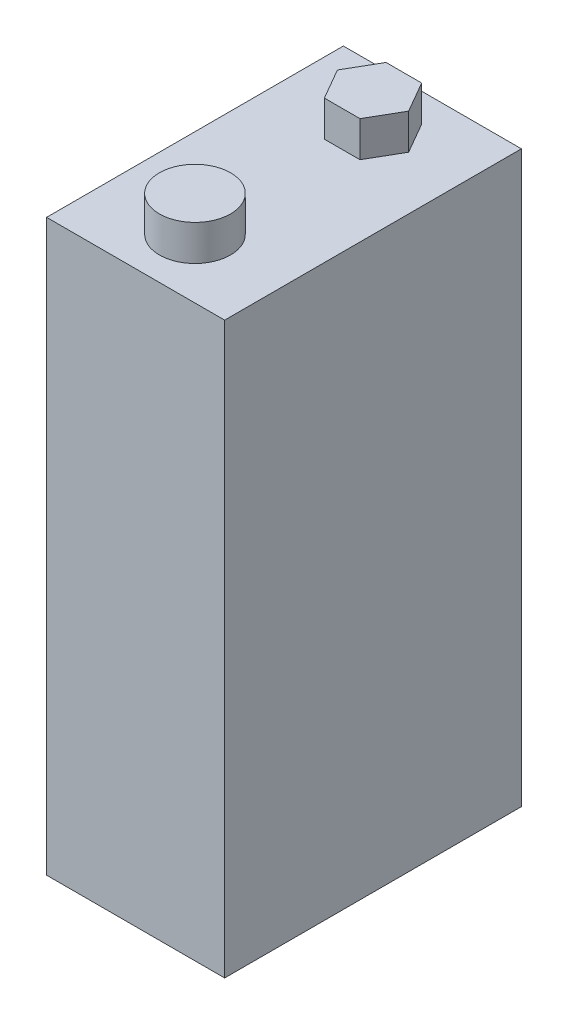
ISO-10303-21;
HEADER;
FILE_DESCRIPTION(('STEP AP214'),'2;1');
FILE_NAME('part.step','',(''),(''),'','','');
FILE_SCHEMA(('AUTOMOTIVE_DESIGN { 1 0 10303 214 1 1 1 1 }'));
ENDSEC;
DATA;
#1=APPLICATION_CONTEXT('core data for automotive mechanical design processes');
#2=APPLICATION_PROTOCOL_DEFINITION('international standard','automotive_design',2000,#1);
#3=PRODUCT_CONTEXT('',#1,'mechanical');
#4=PRODUCT('Part','Part','',(#3));
#5=PRODUCT_RELATED_PRODUCT_CATEGORY('part','',(#4));
#6=PRODUCT_DEFINITION_FORMATION('','',#4);
#7=PRODUCT_DEFINITION_CONTEXT('part definition',#1,'design');
#8=PRODUCT_DEFINITION('design','',#6,#7);
#9=PRODUCT_DEFINITION_SHAPE('','',#8);
#10=(LENGTH_UNIT() NAMED_UNIT(*) SI_UNIT(.MILLI.,.METRE.));
#11=(NAMED_UNIT(*) PLANE_ANGLE_UNIT() SI_UNIT($,.RADIAN.));
#12=(NAMED_UNIT(*) SI_UNIT($,.STERADIAN.) SOLID_ANGLE_UNIT());
#13=UNCERTAINTY_MEASURE_WITH_UNIT(LENGTH_MEASURE(1.E-05),#10,'distance_accuracy_value','');
#14=(GEOMETRIC_REPRESENTATION_CONTEXT(3) GLOBAL_UNCERTAINTY_ASSIGNED_CONTEXT((#13)) GLOBAL_UNIT_ASSIGNED_CONTEXT((#10,
#11,#12)) REPRESENTATION_CONTEXT('',''));
#15=CARTESIAN_POINT('',(0.,0.,0.));
#16=DIRECTION('',(0.,0.,1.));
#17=DIRECTION('',(1.,0.,0.));
#18=AXIS2_PLACEMENT_3D('',#15,#16,#17);
#19=CARTESIAN_POINT('',(15.,0.,0.));
#20=DIRECTION('',(0.,-1.,0.));
#21=DIRECTION('',(0.,0.,-1.));
#22=AXIS2_PLACEMENT_3D('',#19,#20,#21);
#23=PLANE('',#22);
#24=DIRECTION('',(0.,0.,1.));
#25=VECTOR('',#24,1.);
#26=CARTESIAN_POINT('',(0.,0.,0.));
#27=LINE('',#26,#25);
#28=CARTESIAN_POINT('',(0.,0.,-25.));
#29=VERTEX_POINT('',#28);
#30=CARTESIAN_POINT('',(0.,0.,0.));
#31=VERTEX_POINT('',#30);
#32=EDGE_CURVE('E144',#29,#31,#27,.T.);
#33=ORIENTED_EDGE('',*,*,#32,.T.);
#34=DIRECTION('',(-1.,0.,0.));
#35=VECTOR('',#34,1.);
#36=CARTESIAN_POINT('',(15.,0.,0.));
#37=LINE('',#36,#35);
#38=CARTESIAN_POINT('',(15.,0.,0.));
#39=VERTEX_POINT('',#38);
#40=EDGE_CURVE('E150',#39,#31,#37,.T.);
#41=ORIENTED_EDGE('',*,*,#40,.F.);
#42=DIRECTION('',(0.,0.,1.));
#43=VECTOR('',#42,1.);
#44=CARTESIAN_POINT('',(15.,0.,0.));
#45=LINE('',#44,#43);
#46=CARTESIAN_POINT('',(15.,0.,-25.));
#47=VERTEX_POINT('',#46);
#48=EDGE_CURVE('E148',#47,#39,#45,.T.);
#49=ORIENTED_EDGE('',*,*,#48,.F.);
#50=DIRECTION('',(-1.,0.,0.));
#51=VECTOR('',#50,1.);
#52=CARTESIAN_POINT('',(15.,0.,-25.));
#53=LINE('',#52,#51);
#54=EDGE_CURVE('E160',#47,#29,#53,.T.);
#55=ORIENTED_EDGE('',*,*,#54,.T.);
#56=EDGE_LOOP('',(#33,#41,#49,#55));
#57=FACE_BOUND('',#56,.T.);
#58=CARTESIAN_POINT('',(7.5,0.,-5.));
#59=DIRECTION('',(0.,-1.,0.));
#60=DIRECTION('',(0.,0.,-1.));
#61=AXIS2_PLACEMENT_3D('',#58,#59,#60);
#62=CIRCLE('',#61,3.);
#63=CARTESIAN_POINT('',(7.5,0.,-8.));
#64=VERTEX_POINT('',#63);
#65=EDGE_CURVE('E11',#64,#64,#62,.F.);
#66=ORIENTED_EDGE('',*,*,#65,.F.);
#67=EDGE_LOOP('',(#66));
#68=FACE_BOUND('',#67,.T.);
#69=DIRECTION('',(-0.499999999999995,0.,0.866025403784441));
#70=VECTOR('',#69,1.);
#71=CARTESIAN_POINT('',(5.99999999999997,0.,-22.5980762113533));
#72=LINE('',#71,#70);
#73=CARTESIAN_POINT('',(5.99999999999997,0.,-22.5980762113533));
#74=VERTEX_POINT('',#73);
#75=CARTESIAN_POINT('',(4.5,0.,-20.));
#76=VERTEX_POINT('',#75);
#77=EDGE_CURVE('E130',#74,#76,#72,.T.);
#78=ORIENTED_EDGE('',*,*,#77,.F.);
#79=DIRECTION('',(-1.,0.,0.));
#80=VECTOR('',#79,1.);
#81=CARTESIAN_POINT('',(8.99999999999998,0.,-22.5980762113533));
#82=LINE('',#81,#80);
#83=CARTESIAN_POINT('',(8.99999999999998,0.,-22.5980762113533));
#84=VERTEX_POINT('',#83);
#85=EDGE_CURVE('E127',#84,#74,#82,.T.);
#86=ORIENTED_EDGE('',*,*,#85,.F.);
#87=DIRECTION('',(-0.500000000000007,0.,-0.866025403784434));
#88=VECTOR('',#87,1.);
#89=CARTESIAN_POINT('',(10.5,0.,-20.));
#90=LINE('',#89,#88);
#91=CARTESIAN_POINT('',(10.5,0.,-20.));
#92=VERTEX_POINT('',#91);
#93=EDGE_CURVE('E317',#92,#84,#90,.T.);
#94=ORIENTED_EDGE('',*,*,#93,.F.);
#95=DIRECTION('',(0.499999999999995,0.,-0.866025403784442));
#96=VECTOR('',#95,1.);
#97=CARTESIAN_POINT('',(9.00000000000001,0.,-17.4019237886467));
#98=LINE('',#97,#96);
#99=CARTESIAN_POINT('',(9.00000000000001,0.,-17.4019237886467));
#100=VERTEX_POINT('',#99);
#101=EDGE_CURVE('E332',#100,#92,#98,.T.);
#102=ORIENTED_EDGE('',*,*,#101,.F.);
#103=DIRECTION('',(1.,0.,0.));
#104=VECTOR('',#103,1.);
#105=CARTESIAN_POINT('',(6.00000000000001,0.,-17.4019237886467));
#106=LINE('',#105,#104);
#107=CARTESIAN_POINT('',(6.00000000000001,0.,-17.4019237886467));
#108=VERTEX_POINT('',#107);
#109=EDGE_CURVE('E53',#108,#100,#106,.T.);
#110=ORIENTED_EDGE('',*,*,#109,.F.);
#111=DIRECTION('',(0.500000000000001,0.,0.866025403784438));
#112=VECTOR('',#111,1.);
#113=CARTESIAN_POINT('',(4.5,0.,-20.));
#114=LINE('',#113,#112);
#115=EDGE_CURVE('E48',#76,#108,#114,.T.);
#116=ORIENTED_EDGE('',*,*,#115,.F.);
#117=EDGE_LOOP('',(#78,#86,#94,#102,#110,#116));
#118=FACE_BOUND('',#117,.T.);
#119=ADVANCED_FACE('F33',(#57,#68,#118),#23,.F.);
#120=CARTESIAN_POINT('',(15.,0.,0.));
#121=DIRECTION('',(0.,0.,-1.));
#122=DIRECTION('',(0.,1.,0.));
#123=AXIS2_PLACEMENT_3D('',#120,#121,#122);
#124=PLANE('',#123);
#125=DIRECTION('',(0.,-1.,0.));
#126=VECTOR('',#125,1.);
#127=CARTESIAN_POINT('',(0.,0.,0.));
#128=LINE('',#127,#126);
#129=CARTESIAN_POINT('',(0.,-48.,0.));
#130=VERTEX_POINT('',#129);
#131=EDGE_CURVE('E134',#31,#130,#128,.T.);
#132=ORIENTED_EDGE('',*,*,#131,.T.);
#133=DIRECTION('',(-1.,0.,0.));
#134=VECTOR('',#133,1.);
#135=CARTESIAN_POINT('',(15.,-48.,0.));
#136=LINE('',#135,#134);
#137=CARTESIAN_POINT('',(15.,-48.,0.));
#138=VERTEX_POINT('',#137);
#139=EDGE_CURVE('E41',#138,#130,#136,.T.);
#140=ORIENTED_EDGE('',*,*,#139,.F.);
#141=DIRECTION('',(0.,-1.,0.));
#142=VECTOR('',#141,1.);
#143=CARTESIAN_POINT('',(15.,0.,0.));
#144=LINE('',#143,#142);
#145=EDGE_CURVE('E140',#39,#138,#144,.T.);
#146=ORIENTED_EDGE('',*,*,#145,.F.);
#147=ORIENTED_EDGE('',*,*,#40,.T.);
#148=EDGE_LOOP('',(#132,#140,#146,#147));
#149=FACE_BOUND('',#148,.T.);
#150=ADVANCED_FACE('F35',(#149),#124,.F.);
#151=CARTESIAN_POINT('',(15.,-48.,0.));
#152=DIRECTION('',(0.,1.,0.));
#153=DIRECTION('',(0.,0.,1.));
#154=AXIS2_PLACEMENT_3D('',#151,#152,#153);
#155=PLANE('',#154);
#156=DIRECTION('',(0.,0.,-1.));
#157=VECTOR('',#156,1.);
#158=CARTESIAN_POINT('',(0.,-48.,0.));
#159=LINE('',#158,#157);
#160=CARTESIAN_POINT('',(0.,-48.,-25.));
#161=VERTEX_POINT('',#160);
#162=EDGE_CURVE('E153',#130,#161,#159,.T.);
#163=ORIENTED_EDGE('',*,*,#162,.T.);
#164=DIRECTION('',(-1.,0.,0.));
#165=VECTOR('',#164,1.);
#166=CARTESIAN_POINT('',(15.,-48.,-25.));
#167=LINE('',#166,#165);
#168=CARTESIAN_POINT('',(15.,-48.,-25.));
#169=VERTEX_POINT('',#168);
#170=EDGE_CURVE('E163',#169,#161,#167,.T.);
#171=ORIENTED_EDGE('',*,*,#170,.F.);
#172=DIRECTION('',(0.,0.,-1.));
#173=VECTOR('',#172,1.);
#174=CARTESIAN_POINT('',(15.,-48.,0.));
#175=LINE('',#174,#173);
#176=EDGE_CURVE('E143',#138,#169,#175,.T.);
#177=ORIENTED_EDGE('',*,*,#176,.F.);
#178=ORIENTED_EDGE('',*,*,#139,.T.);
#179=EDGE_LOOP('',(#163,#171,#177,#178));
#180=FACE_BOUND('',#179,.T.);
#181=ADVANCED_FACE('F168',(#180),#155,.F.);
#182=CARTESIAN_POINT('',(15.,0.,-25.));
#183=DIRECTION('',(0.,0.,1.));
#184=DIRECTION('',(0.,-1.,0.));
#185=AXIS2_PLACEMENT_3D('',#182,#183,#184);
#186=PLANE('',#185);
#187=DIRECTION('',(0.,1.,0.));
#188=VECTOR('',#187,1.);
#189=CARTESIAN_POINT('',(0.,0.,-25.));
#190=LINE('',#189,#188);
#191=EDGE_CURVE('E155',#161,#29,#190,.T.);
#192=ORIENTED_EDGE('',*,*,#191,.T.);
#193=ORIENTED_EDGE('',*,*,#54,.F.);
#194=DIRECTION('',(0.,1.,0.));
#195=VECTOR('',#194,1.);
#196=CARTESIAN_POINT('',(15.,0.,-25.));
#197=LINE('',#196,#195);
#198=EDGE_CURVE('E146',#169,#47,#197,.T.);
#199=ORIENTED_EDGE('',*,*,#198,.F.);
#200=ORIENTED_EDGE('',*,*,#170,.T.);
#201=EDGE_LOOP('',(#192,#193,#199,#200));
#202=FACE_BOUND('',#201,.T.);
#203=ADVANCED_FACE('F180',(#202),#186,.F.);
#204=CARTESIAN_POINT('',(15.,0.,0.));
#205=DIRECTION('',(1.,0.,0.));
#206=DIRECTION('',(0.,0.,-1.));
#207=AXIS2_PLACEMENT_3D('',#204,#205,#206);
#208=PLANE('',#207);
#209=ORIENTED_EDGE('',*,*,#145,.T.);
#210=ORIENTED_EDGE('',*,*,#176,.T.);
#211=ORIENTED_EDGE('',*,*,#198,.T.);
#212=ORIENTED_EDGE('',*,*,#48,.T.);
#213=EDGE_LOOP('',(#209,#210,#211,#212));
#214=FACE_BOUND('',#213,.T.);
#215=ADVANCED_FACE('F186',(#214),#208,.T.);
#216=CARTESIAN_POINT('',(0.,0.,0.));
#217=DIRECTION('',(1.,0.,0.));
#218=DIRECTION('',(0.,0.,-1.));
#219=AXIS2_PLACEMENT_3D('',#216,#217,#218);
#220=PLANE('',#219);
#221=ORIENTED_EDGE('',*,*,#131,.F.);
#222=ORIENTED_EDGE('',*,*,#32,.F.);
#223=ORIENTED_EDGE('',*,*,#191,.F.);
#224=ORIENTED_EDGE('',*,*,#162,.F.);
#225=EDGE_LOOP('',(#221,#222,#223,#224));
#226=FACE_BOUND('',#225,.T.);
#227=ADVANCED_FACE('F176',(#226),#220,.F.);
#228=CARTESIAN_POINT('',(7.5,3.,-5.));
#229=DIRECTION('',(0.,-1.,0.));
#230=DIRECTION('',(0.,0.,-1.));
#231=AXIS2_PLACEMENT_3D('',#228,#229,#230);
#232=CYLINDRICAL_SURFACE('',#231,3.);
#233=CARTESIAN_POINT('',(7.5,3.,-5.));
#234=DIRECTION('',(0.,1.,0.));
#235=DIRECTION('',(0.,0.,1.));
#236=AXIS2_PLACEMENT_3D('',#233,#234,#235);
#237=CIRCLE('',#236,3.);
#238=CARTESIAN_POINT('',(7.5,3.,-2.));
#239=VERTEX_POINT('',#238);
#240=EDGE_CURVE('E131',#239,#239,#237,.T.);
#241=ORIENTED_EDGE('',*,*,#240,.F.);
#242=EDGE_LOOP('',(#241));
#243=FACE_BOUND('',#242,.T.);
#244=ORIENTED_EDGE('',*,*,#65,.T.);
#245=EDGE_LOOP('',(#244));
#246=FACE_BOUND('',#245,.T.);
#247=ADVANCED_FACE('F193',(#243,#246),#232,.T.);
#248=CARTESIAN_POINT('',(7.5,3.,-5.));
#249=DIRECTION('',(0.,1.,0.));
#250=DIRECTION('',(0.,0.,1.));
#251=AXIS2_PLACEMENT_3D('',#248,#249,#250);
#252=PLANE('',#251);
#253=ORIENTED_EDGE('',*,*,#240,.T.);
#254=EDGE_LOOP('',(#253));
#255=FACE_BOUND('',#254,.T.);
#256=ADVANCED_FACE('F234',(#255),#252,.T.);
#257=CARTESIAN_POINT('',(5.99999999999997,3.,-22.5980762113533));
#258=DIRECTION('',(0.866025403784441,0.,0.499999999999995));
#259=DIRECTION('',(0.499999999999995,0.,-0.866025403784442));
#260=AXIS2_PLACEMENT_3D('',#257,#258,#259);
#261=PLANE('',#260);
#262=ORIENTED_EDGE('',*,*,#77,.T.);
#263=DIRECTION('',(0.,-1.,0.));
#264=VECTOR('',#263,1.);
#265=CARTESIAN_POINT('',(4.5,3.,-20.));
#266=LINE('',#265,#264);
#267=CARTESIAN_POINT('',(4.5,3.,-20.));
#268=VERTEX_POINT('',#267);
#269=EDGE_CURVE('E111',#268,#76,#266,.T.);
#270=ORIENTED_EDGE('',*,*,#269,.F.);
#271=DIRECTION('',(-0.499999999999995,0.,0.866025403784441));
#272=VECTOR('',#271,1.);
#273=CARTESIAN_POINT('',(5.99999999999997,3.,-22.5980762113533));
#274=LINE('',#273,#272);
#275=CARTESIAN_POINT('',(5.99999999999997,3.,-22.5980762113533));
#276=VERTEX_POINT('',#275);
#277=EDGE_CURVE('E118',#276,#268,#274,.T.);
#278=ORIENTED_EDGE('',*,*,#277,.F.);
#279=DIRECTION('',(0.,-1.,0.));
#280=VECTOR('',#279,1.);
#281=CARTESIAN_POINT('',(5.99999999999997,3.,-22.5980762113533));
#282=LINE('',#281,#280);
#283=EDGE_CURVE('E313',#276,#74,#282,.T.);
#284=ORIENTED_EDGE('',*,*,#283,.T.);
#285=EDGE_LOOP('',(#262,#270,#278,#284));
#286=FACE_BOUND('',#285,.T.);
#287=ADVANCED_FACE('F129',(#286),#261,.F.);
#288=CARTESIAN_POINT('',(4.5,3.,-20.));
#289=DIRECTION('',(0.866025403784438,0.,-0.500000000000001));
#290=DIRECTION('',(-0.500000000000001,0.,-0.866025403784438));
#291=AXIS2_PLACEMENT_3D('',#288,#289,#290);
#292=PLANE('',#291);
#293=ORIENTED_EDGE('',*,*,#115,.T.);
#294=DIRECTION('',(0.,-1.,0.));
#295=VECTOR('',#294,1.);
#296=CARTESIAN_POINT('',(6.00000000000001,3.,-17.4019237886467));
#297=LINE('',#296,#295);
#298=CARTESIAN_POINT('',(6.00000000000001,3.,-17.4019237886467));
#299=VERTEX_POINT('',#298);
#300=EDGE_CURVE('E114',#299,#108,#297,.T.);
#301=ORIENTED_EDGE('',*,*,#300,.F.);
#302=DIRECTION('',(0.500000000000001,0.,0.866025403784438));
#303=VECTOR('',#302,1.);
#304=CARTESIAN_POINT('',(4.5,3.,-20.));
#305=LINE('',#304,#303);
#306=EDGE_CURVE('E107',#268,#299,#305,.T.);
#307=ORIENTED_EDGE('',*,*,#306,.F.);
#308=ORIENTED_EDGE('',*,*,#269,.T.);
#309=EDGE_LOOP('',(#293,#301,#307,#308));
#310=FACE_BOUND('',#309,.T.);
#311=ADVANCED_FACE('F109',(#310),#292,.F.);
#312=CARTESIAN_POINT('',(6.00000000000001,3.,-17.4019237886467));
#313=DIRECTION('',(0.,0.,-1.));
#314=DIRECTION('',(-1.,0.,0.));
#315=AXIS2_PLACEMENT_3D('',#312,#313,#314);
#316=PLANE('',#315);
#317=ORIENTED_EDGE('',*,*,#109,.T.);
#318=DIRECTION('',(0.,-1.,0.));
#319=VECTOR('',#318,1.);
#320=CARTESIAN_POINT('',(9.00000000000001,3.,-17.4019237886467));
#321=LINE('',#320,#319);
#322=CARTESIAN_POINT('',(9.00000000000001,3.,-17.4019237886467));
#323=VERTEX_POINT('',#322);
#324=EDGE_CURVE('E136',#323,#100,#321,.T.);
#325=ORIENTED_EDGE('',*,*,#324,.F.);
#326=DIRECTION('',(1.,0.,0.));
#327=VECTOR('',#326,1.);
#328=CARTESIAN_POINT('',(6.00000000000001,3.,-17.4019237886467));
#329=LINE('',#328,#327);
#330=EDGE_CURVE('E117',#299,#323,#329,.T.);
#331=ORIENTED_EDGE('',*,*,#330,.F.);
#332=ORIENTED_EDGE('',*,*,#300,.T.);
#333=EDGE_LOOP('',(#317,#325,#331,#332));
#334=FACE_BOUND('',#333,.T.);
#335=ADVANCED_FACE('F260',(#334),#316,.F.);
#336=CARTESIAN_POINT('',(9.00000000000001,3.,-17.4019237886467));
#337=DIRECTION('',(-0.866025403784441,0.,-0.499999999999995));
#338=DIRECTION('',(-0.499999999999995,0.,0.866025403784442));
#339=AXIS2_PLACEMENT_3D('',#336,#337,#338);
#340=PLANE('',#339);
#341=ORIENTED_EDGE('',*,*,#101,.T.);
#342=DIRECTION('',(0.,-1.,0.));
#343=VECTOR('',#342,1.);
#344=CARTESIAN_POINT('',(10.5,3.,-20.));
#345=LINE('',#344,#343);
#346=CARTESIAN_POINT('',(10.5,3.,-20.));
#347=VERTEX_POINT('',#346);
#348=EDGE_CURVE('E320',#347,#92,#345,.T.);
#349=ORIENTED_EDGE('',*,*,#348,.F.);
#350=DIRECTION('',(0.499999999999995,0.,-0.866025403784442));
#351=VECTOR('',#350,1.);
#352=CARTESIAN_POINT('',(9.00000000000001,3.,-17.4019237886467));
#353=LINE('',#352,#351);
#354=EDGE_CURVE('E333',#323,#347,#353,.T.);
#355=ORIENTED_EDGE('',*,*,#354,.F.);
#356=ORIENTED_EDGE('',*,*,#324,.T.);
#357=EDGE_LOOP('',(#341,#349,#355,#356));
#358=FACE_BOUND('',#357,.T.);
#359=ADVANCED_FACE('F269',(#358),#340,.F.);
#360=CARTESIAN_POINT('',(10.5,3.,-20.));
#361=DIRECTION('',(-0.866025403784434,0.,0.500000000000007));
#362=DIRECTION('',(0.500000000000007,0.,0.866025403784435));
#363=AXIS2_PLACEMENT_3D('',#360,#361,#362);
#364=PLANE('',#363);
#365=ORIENTED_EDGE('',*,*,#93,.T.);
#366=DIRECTION('',(0.,-1.,0.));
#367=VECTOR('',#366,1.);
#368=CARTESIAN_POINT('',(8.99999999999998,3.,-22.5980762113533));
#369=LINE('',#368,#367);
#370=CARTESIAN_POINT('',(8.99999999999998,3.,-22.5980762113533));
#371=VERTEX_POINT('',#370);
#372=EDGE_CURVE('E315',#371,#84,#369,.T.);
#373=ORIENTED_EDGE('',*,*,#372,.F.);
#374=DIRECTION('',(-0.500000000000007,0.,-0.866025403784434));
#375=VECTOR('',#374,1.);
#376=CARTESIAN_POINT('',(10.5,3.,-20.));
#377=LINE('',#376,#375);
#378=EDGE_CURVE('E322',#347,#371,#377,.T.);
#379=ORIENTED_EDGE('',*,*,#378,.F.);
#380=ORIENTED_EDGE('',*,*,#348,.T.);
#381=EDGE_LOOP('',(#365,#373,#379,#380));
#382=FACE_BOUND('',#381,.T.);
#383=ADVANCED_FACE('F279',(#382),#364,.F.);
#384=CARTESIAN_POINT('',(8.99999999999998,3.,-22.5980762113533));
#385=DIRECTION('',(0.,0.,1.));
#386=DIRECTION('',(1.,0.,0.));
#387=AXIS2_PLACEMENT_3D('',#384,#385,#386);
#388=PLANE('',#387);
#389=ORIENTED_EDGE('',*,*,#85,.T.);
#390=ORIENTED_EDGE('',*,*,#283,.F.);
#391=DIRECTION('',(-1.,0.,0.));
#392=VECTOR('',#391,1.);
#393=CARTESIAN_POINT('',(8.99999999999998,3.,-22.5980762113533));
#394=LINE('',#393,#392);
#395=EDGE_CURVE('E123',#371,#276,#394,.T.);
#396=ORIENTED_EDGE('',*,*,#395,.F.);
#397=ORIENTED_EDGE('',*,*,#372,.T.);
#398=EDGE_LOOP('',(#389,#390,#396,#397));
#399=FACE_BOUND('',#398,.T.);
#400=ADVANCED_FACE('F289',(#399),#388,.F.);
#401=CARTESIAN_POINT('',(0.,3.,0.));
#402=DIRECTION('',(0.,1.,0.));
#403=DIRECTION('',(0.,0.,1.));
#404=AXIS2_PLACEMENT_3D('',#401,#402,#403);
#405=PLANE('',#404);
#406=ORIENTED_EDGE('',*,*,#277,.T.);
#407=ORIENTED_EDGE('',*,*,#306,.T.);
#408=ORIENTED_EDGE('',*,*,#330,.T.);
#409=ORIENTED_EDGE('',*,*,#354,.T.);
#410=ORIENTED_EDGE('',*,*,#378,.T.);
#411=ORIENTED_EDGE('',*,*,#395,.T.);
#412=EDGE_LOOP('',(#406,#407,#408,#409,#410,#411));
#413=FACE_BOUND('',#412,.T.);
#414=ADVANCED_FACE('F121',(#413),#405,.T.);
#415=CLOSED_SHELL('',(#119,#150,#181,#203,#215,#227,#247,#256,#287,#311,#335,#359,#383,#400,#414));
#416=MANIFOLD_SOLID_BREP('B2',#415);
#417=ADVANCED_BREP_SHAPE_REPRESENTATION('',(#18,#416),#14);
#418=SHAPE_DEFINITION_REPRESENTATION(#9,#417);
ENDSEC;
END-ISO-10303-21;
